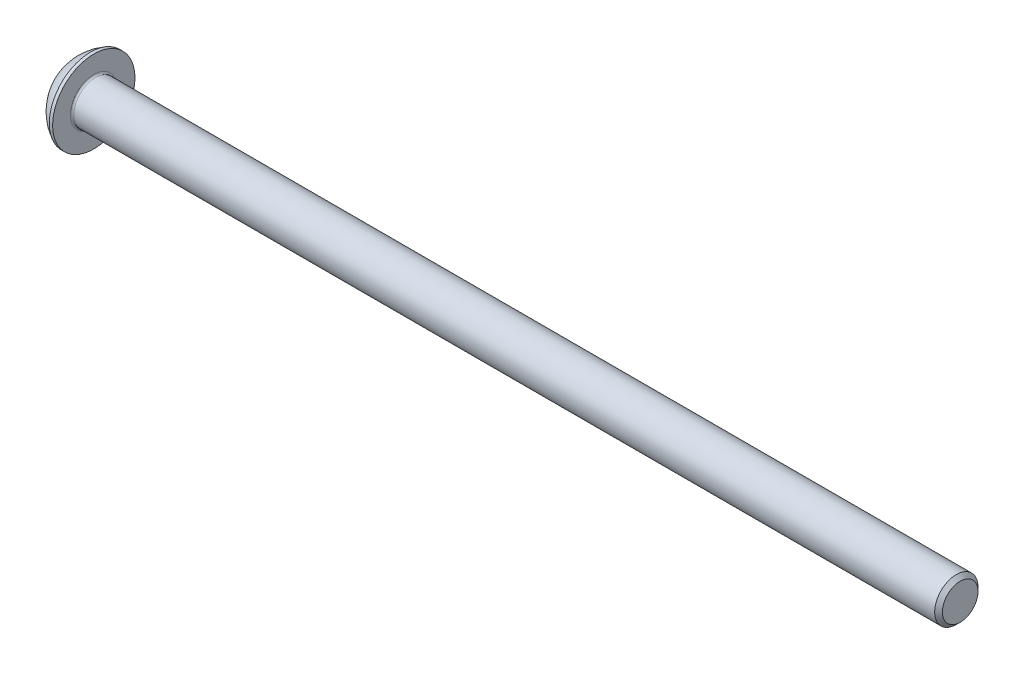
ISO-10303-21;
HEADER;
FILE_DESCRIPTION(('STEP AP214'),'2;1');
FILE_NAME('part.step','',(''),(''),'','','');
FILE_SCHEMA(('AUTOMOTIVE_DESIGN { 1 0 10303 214 1 1 1 1 }'));
ENDSEC;
DATA;
#1=APPLICATION_CONTEXT('core data for automotive mechanical design processes');
#2=APPLICATION_PROTOCOL_DEFINITION('international standard','automotive_design',2000,#1);
#3=PRODUCT_CONTEXT('',#1,'mechanical');
#4=PRODUCT('Part','Part','',(#3));
#5=PRODUCT_RELATED_PRODUCT_CATEGORY('part','',(#4));
#6=PRODUCT_DEFINITION_FORMATION('','',#4);
#7=PRODUCT_DEFINITION_CONTEXT('part definition',#1,'design');
#8=PRODUCT_DEFINITION('design','',#6,#7);
#9=PRODUCT_DEFINITION_SHAPE('','',#8);
#10=(LENGTH_UNIT() NAMED_UNIT(*) SI_UNIT(.MILLI.,.METRE.));
#11=(NAMED_UNIT(*) PLANE_ANGLE_UNIT() SI_UNIT($,.RADIAN.));
#12=(NAMED_UNIT(*) SI_UNIT($,.STERADIAN.) SOLID_ANGLE_UNIT());
#13=UNCERTAINTY_MEASURE_WITH_UNIT(LENGTH_MEASURE(1.E-05),#10,'distance_accuracy_value','');
#14=(GEOMETRIC_REPRESENTATION_CONTEXT(3) GLOBAL_UNCERTAINTY_ASSIGNED_CONTEXT((#13)) GLOBAL_UNIT_ASSIGNED_CONTEXT((#10,
#11,#12)) REPRESENTATION_CONTEXT('',''));
#15=CARTESIAN_POINT('',(0.,0.,0.));
#16=DIRECTION('',(0.,0.,1.));
#17=DIRECTION('',(1.,0.,0.));
#18=AXIS2_PLACEMENT_3D('',#15,#16,#17);
#19=CARTESIAN_POINT('',(0.,0.,0.));
#20=DIRECTION('',(-1.,0.,0.));
#21=DIRECTION('',(0.,0.,1.));
#22=AXIS2_PLACEMENT_3D('',#19,#20,#21);
#23=PLANE('',#22);
#24=CARTESIAN_POINT('',(0.,0.,0.));
#25=DIRECTION('',(-1.,0.,0.));
#26=DIRECTION('',(0.,0.,1.));
#27=AXIS2_PLACEMENT_3D('',#24,#25,#26);
#28=CIRCLE('',#27,2.375);
#29=CARTESIAN_POINT('',(0.,2.375,0.));
#30=VERTEX_POINT('',#29);
#31=EDGE_CURVE('E155',#30,#30,#28,.T.);
#32=ORIENTED_EDGE('',*,*,#31,.T.);
#33=EDGE_LOOP('',(#32));
#34=FACE_BOUND('',#33,.T.);
#35=DIRECTION('',(0.,-1.,0.));
#36=VECTOR('',#35,1.);
#37=CARTESIAN_POINT('',(0.,-0.866025403784438,1.5));
#38=LINE('',#37,#36);
#39=CARTESIAN_POINT('',(0.,0.866025403784439,1.5));
#40=VERTEX_POINT('',#39);
#41=CARTESIAN_POINT('',(0.,-0.866025403784438,1.5));
#42=VERTEX_POINT('',#41);
#43=EDGE_CURVE('E50',#40,#42,#38,.T.);
#44=ORIENTED_EDGE('',*,*,#43,.T.);
#45=DIRECTION('',(0.,-0.500000000000001,-0.866025403784438));
#46=VECTOR('',#45,1.);
#47=CARTESIAN_POINT('',(0.,-1.73205080756888,0.));
#48=LINE('',#47,#46);
#49=CARTESIAN_POINT('',(0.,-1.73205080756888,0.));
#50=VERTEX_POINT('',#49);
#51=EDGE_CURVE('E275',#42,#50,#48,.T.);
#52=ORIENTED_EDGE('',*,*,#51,.T.);
#53=DIRECTION('',(0.,0.500000000000001,-0.866025403784438));
#54=VECTOR('',#53,1.);
#55=CARTESIAN_POINT('',(0.,-0.866025403784438,-1.5));
#56=LINE('',#55,#54);
#57=CARTESIAN_POINT('',(0.,-0.866025403784438,-1.5));
#58=VERTEX_POINT('',#57);
#59=EDGE_CURVE('E130',#50,#58,#56,.T.);
#60=ORIENTED_EDGE('',*,*,#59,.T.);
#61=DIRECTION('',(0.,1.,0.));
#62=VECTOR('',#61,1.);
#63=CARTESIAN_POINT('',(0.,0.866025403784439,-1.5));
#64=LINE('',#63,#62);
#65=CARTESIAN_POINT('',(0.,0.866025403784439,-1.5));
#66=VERTEX_POINT('',#65);
#67=EDGE_CURVE('E278',#58,#66,#64,.T.);
#68=ORIENTED_EDGE('',*,*,#67,.T.);
#69=DIRECTION('',(0.,0.5,0.866025403784439));
#70=VECTOR('',#69,1.);
#71=CARTESIAN_POINT('',(0.,1.73205080756888,0.));
#72=LINE('',#71,#70);
#73=CARTESIAN_POINT('',(0.,1.73205080756888,0.));
#74=VERTEX_POINT('',#73);
#75=EDGE_CURVE('E280',#66,#74,#72,.T.);
#76=ORIENTED_EDGE('',*,*,#75,.T.);
#77=DIRECTION('',(0.,-0.5,0.866025403784439));
#78=VECTOR('',#77,1.);
#79=CARTESIAN_POINT('',(0.,0.866025403784439,1.5));
#80=LINE('',#79,#78);
#81=EDGE_CURVE('E282',#74,#40,#80,.T.);
#82=ORIENTED_EDGE('',*,*,#81,.T.);
#83=EDGE_LOOP('',(#44,#52,#60,#68,#76,#82));
#84=FACE_BOUND('',#83,.T.);
#85=ADVANCED_FACE('F35',(#34,#84),#23,.T.);
#86=CARTESIAN_POINT('',(4.75501582278481,0.,0.));
#87=DIRECTION('',(-1.,0.,0.));
#88=DIRECTION('',(0.,1.,0.));
#89=AXIS2_PLACEMENT_3D('',#86,#87,#88);
#90=SPHERICAL_SURFACE('',#89,5.3151482081814);
#91=CARTESIAN_POINT('',(2.37,0.,0.));
#92=DIRECTION('',(-1.,0.,0.));
#93=DIRECTION('',(0.,0.,1.));
#94=AXIS2_PLACEMENT_3D('',#91,#92,#93);
#95=CIRCLE('',#94,4.75);
#96=CARTESIAN_POINT('',(2.37,4.75,0.));
#97=VERTEX_POINT('',#96);
#98=EDGE_CURVE('E152',#97,#97,#95,.T.);
#99=CARTESIAN_POINT('',(2.37,4.75,0.));
#100=CARTESIAN_POINT('',(2.33822259048669,4.73404434732511,0.));
#101=CARTESIAN_POINT('',(2.30660534291523,4.71776971995817,0.));
#102=CARTESIAN_POINT('',(2.24370380094997,4.68458927158339,0.));
#103=CARTESIAN_POINT('',(2.21241950655618,4.66768345057555,0.));
#104=CARTESIAN_POINT('',(2.15019650024021,4.6332473706621,0.));
#105=CARTESIAN_POINT('',(2.11925778831804,4.6157171117565,0.));
#106=CARTESIAN_POINT('',(2.05773840110808,4.58003923142985,0.));
#107=CARTESIAN_POINT('',(2.02715772582028,4.56189161000879,0.));
#108=CARTESIAN_POINT('',(1.96636673145741,4.52498631044657,0.));
#109=CARTESIAN_POINT('',(1.93615641238234,4.50622863230542,0.));
#110=CARTESIAN_POINT('',(1.87611829826807,4.46811077571318,0.));
#111=CARTESIAN_POINT('',(1.84629050322887,4.4487505972621,0.));
#112=CARTESIAN_POINT('',(1.78702945162455,4.40943553782984,0.));
#113=CARTESIAN_POINT('',(1.75759619505941,4.38948065684866,0.));
#114=CARTESIAN_POINT('',(1.69913607574061,4.34898423002648,0.));
#115=CARTESIAN_POINT('',(1.67010921298694,4.32844268418549,0.));
#116=CARTESIAN_POINT('',(1.61247357298735,4.28678120152175,0.));
#117=CARTESIAN_POINT('',(1.58386479574144,4.265661264699,0.));
#118=CARTESIAN_POINT('',(1.52707685004032,4.22285150694424,0.));
#119=CARTESIAN_POINT('',(1.49889768158512,4.20116168601223,0.));
#120=CARTESIAN_POINT('',(1.44298030371049,4.15722089644741,0.));
#121=CARTESIAN_POINT('',(1.41524209429107,4.13496992781461,0.));
#122=CARTESIAN_POINT('',(1.36021780711889,4.08991580528235,0.));
#123=CARTESIAN_POINT('',(1.33293172936613,4.06711265138288,0.));
#124=CARTESIAN_POINT('',(1.278822696045,4.02096334316478,0.));
#125=CARTESIAN_POINT('',(1.25199974047662,3.99761718884614,0.));
#126=CARTESIAN_POINT('',(1.19882775550162,3.95039128335163,0.));
#127=CARTESIAN_POINT('',(1.172478726095,3.92651153217576,0.));
#128=CARTESIAN_POINT('',(1.1202652065289,3.87822805145535,0.));
#129=CARTESIAN_POINT('',(1.09440071636942,3.85382432191081,0.));
#130=CARTESIAN_POINT('',(1.04316669321618,3.8045027139941,0.));
#131=CARTESIAN_POINT('',(1.01779716022241,3.77958483562192,0.));
#132=CARTESIAN_POINT('',(0.9675632699561,3.72924496668416,0.));
#133=CARTESIAN_POINT('',(0.942698912683562,3.70382297611859,0.));
#134=CARTESIAN_POINT('',(0.893485388936279,3.65248512247887,0.));
#135=CARTESIAN_POINT('',(0.869136222461535,3.62656925940472,0.));
#136=CARTESIAN_POINT('',(0.820962887873489,3.57425409935885,0.));
#137=CARTESIAN_POINT('',(0.797138719760188,3.54785480238711,0.));
#138=CARTESIAN_POINT('',(0.750024977995378,3.49458340787865,0.));
#139=CARTESIAN_POINT('',(0.726735404343869,3.46771131034191,0.));
#140=CARTESIAN_POINT('',(0.68070023227454,3.41350513847464,0.));
#141=CARTESIAN_POINT('',(0.657954633856721,3.3861710641441,0.));
#142=CARTESIAN_POINT('',(0.613016573919582,3.33105194853939,0.));
#143=CARTESIAN_POINT('',(0.590824112400263,3.30326690726522,0.));
#144=CARTESIAN_POINT('',(0.547001265128254,3.24725704926748,0.));
#145=CARTESIAN_POINT('',(0.525370879375564,3.21903223254391,0.));
#146=CARTESIAN_POINT('',(0.482680896105488,3.16215419227902,0.));
#147=CARTESIAN_POINT('',(0.461621298588104,3.13350096873769,0.));
#148=CARTESIAN_POINT('',(0.420081374357153,3.07577765602273,0.));
#149=CARTESIAN_POINT('',(0.399601047643587,3.04670756684908,0.));
#150=CARTESIAN_POINT('',(0.359227914239947,2.98816223197683,0.));
#151=CARTESIAN_POINT('',(0.339335107549873,2.95868698627822,0.));
#152=CARTESIAN_POINT('',(0.300145026860787,2.89934321060632,0.));
#153=CARTESIAN_POINT('',(0.280847752861776,2.86947468063304,0.));
#154=CARTESIAN_POINT('',(0.24285650999714,2.80935636725696,0.));
#155=CARTESIAN_POINT('',(0.224162541131515,2.77910658385417,0.));
#156=CARTESIAN_POINT('',(0.187385439283607,2.71823794734018,0.));
#157=CARTESIAN_POINT('',(0.169302306301324,2.68761909422898,0.));
#158=CARTESIAN_POINT('',(0.133754156035988,2.626024653246,0.));
#159=CARTESIAN_POINT('',(0.116289138752934,2.59504906537422,0.));
#160=CARTESIAN_POINT('',(0.081984269005742,2.53275362391635,0.));
#161=CARTESIAN_POINT('',(0.0651444165416036,2.50143377033028,0.));
#162=CARTESIAN_POINT('',(0.0320966055444289,2.43846244094735,0.));
#163=CARTESIAN_POINT('',(0.0158886470113927,2.40681096515049,0.));
#164=CARTESIAN_POINT('',(0.,2.375,0.));
#165=B_SPLINE_CURVE_WITH_KNOTS('',3,(#99,#100,#101,#102,#103,#104,#105,#106,#107,#108,#109,#110,
#111,#112,#113,#114,#115,#116,#117,#118,#119,#120,#121,#122,#123,#124,#125,#126,#127,#128,#129,
#130,#131,#132,#133,#134,#135,#136,#137,#138,#139,#140,#141,#142,#143,#144,#145,#146,#147,#148,
#149,#150,#151,#152,#153,#154,#155,#156,#157,#158,#159,#160,#161,#162,#163,#164),.UNSPECIFIED.,
.F.,.F.,(4,2,2,2,2,2,2,2,2,2,2,2,2,2,2,2,2,2,2,2,2,2,2,2,2,2,2,2,2,2,2,2,4),(0.,
0.106672849678272,0.213345699356545,0.320018549034817,0.42669139871309,0.533364248391363,
0.640037098069635,0.746709947747908,0.85338279742618,0.960055647104452,1.06672849678273,
1.173401346461,1.28007419613927,1.38674704581754,1.49341989549582,1.60009274517409,
1.70676559485236,1.81343844453063,1.9201112942089,2.02678414388718,2.13345699356545,
2.24012984324372,2.346802692922,2.45347554260027,2.56014839227854,2.66682124195681,
2.77349409163509,2.88016694131336,2.98683979099163,3.0935126406699,3.20018549034817,
3.30685834002645,3.41353118970472),.UNSPECIFIED.);
#166=EDGE_CURVE('BSEAM176',#97,#30,#165,.T.);
#167=ORIENTED_EDGE('',*,*,#98,.T.);
#168=ORIENTED_EDGE('',*,*,#31,.F.);
#169=ORIENTED_EDGE('',*,*,#166,.T.);
#170=ORIENTED_EDGE('',*,*,#166,.F.);
#171=EDGE_LOOP('',(#167,#169,#168,#170));
#172=FACE_BOUND('',#171,.T.);
#173=ADVANCED_FACE('F176',(#172),#90,.T.);
#174=CARTESIAN_POINT('',(0.,0.,0.));
#175=DIRECTION('',(-1.,0.,0.));
#176=DIRECTION('',(0.,0.,1.));
#177=AXIS2_PLACEMENT_3D('',#174,#175,#176);
#178=CYLINDRICAL_SURFACE('',#177,4.75);
#179=ORIENTED_EDGE('',*,*,#98,.F.);
#180=EDGE_LOOP('',(#179));
#181=FACE_BOUND('',#180,.T.);
#182=CARTESIAN_POINT('',(2.75,0.,0.));
#183=DIRECTION('',(-1.,0.,0.));
#184=DIRECTION('',(0.,0.,1.));
#185=AXIS2_PLACEMENT_3D('',#182,#183,#184);
#186=CIRCLE('',#185,4.75);
#187=CARTESIAN_POINT('',(2.75,0.,4.75));
#188=VERTEX_POINT('',#187);
#189=EDGE_CURVE('E149',#188,#188,#186,.T.);
#190=ORIENTED_EDGE('',*,*,#189,.T.);
#191=EDGE_LOOP('',(#190));
#192=FACE_BOUND('',#191,.T.);
#193=ADVANCED_FACE('F181',(#181,#192),#178,.T.);
#194=CARTESIAN_POINT('',(2.75,2.5,0.));
#195=DIRECTION('',(-1.,0.,0.));
#196=DIRECTION('',(0.,0.,1.));
#197=AXIS2_PLACEMENT_3D('',#194,#195,#196);
#198=PLANE('',#197);
#199=CARTESIAN_POINT('',(2.75,0.,0.));
#200=DIRECTION('',(-1.,0.,0.));
#201=DIRECTION('',(0.,0.,1.));
#202=AXIS2_PLACEMENT_3D('',#199,#200,#201);
#203=CIRCLE('',#202,2.70000000000001);
#204=CARTESIAN_POINT('',(2.75,0.,2.70000000000001));
#205=VERTEX_POINT('',#204);
#206=EDGE_CURVE('E43',#205,#205,#203,.T.);
#207=ORIENTED_EDGE('',*,*,#206,.T.);
#208=EDGE_LOOP('',(#207));
#209=FACE_BOUND('',#208,.T.);
#210=ORIENTED_EDGE('',*,*,#189,.F.);
#211=EDGE_LOOP('',(#210));
#212=FACE_BOUND('',#211,.T.);
#213=ADVANCED_FACE('F160',(#209,#212),#198,.F.);
#214=CARTESIAN_POINT('',(0.,0.,0.));
#215=DIRECTION('',(-1.,0.,0.));
#216=DIRECTION('',(0.,0.,1.));
#217=AXIS2_PLACEMENT_3D('',#214,#215,#216);
#218=CYLINDRICAL_SURFACE('',#217,2.50000000000001);
#219=CARTESIAN_POINT('',(2.95,0.,0.));
#220=DIRECTION('',(-1.,0.,0.));
#221=DIRECTION('',(0.,0.,1.));
#222=AXIS2_PLACEMENT_3D('',#219,#220,#221);
#223=CIRCLE('',#222,2.50000000000001);
#224=CARTESIAN_POINT('',(2.95,0.,2.50000000000001));
#225=VERTEX_POINT('',#224);
#226=EDGE_CURVE('E11',#225,#225,#223,.F.);
#227=ORIENTED_EDGE('',*,*,#226,.T.);
#228=EDGE_LOOP('',(#227));
#229=FACE_BOUND('',#228,.T.);
#230=CARTESIAN_POINT('',(102.305,0.,0.));
#231=DIRECTION('',(-1.,0.,0.));
#232=DIRECTION('',(0.,0.,1.));
#233=AXIS2_PLACEMENT_3D('',#230,#231,#232);
#234=CIRCLE('',#233,2.50000000000002);
#235=CARTESIAN_POINT('',(102.305,0.,2.50000000000002));
#236=VERTEX_POINT('',#235);
#237=EDGE_CURVE('E146',#236,#236,#234,.T.);
#238=ORIENTED_EDGE('',*,*,#237,.T.);
#239=EDGE_LOOP('',(#238));
#240=FACE_BOUND('',#239,.T.);
#241=ADVANCED_FACE('F190',(#229,#240),#218,.T.);
#242=CARTESIAN_POINT('',(102.75,0.,0.));
#243=DIRECTION('',(-1.,0.,0.));
#244=DIRECTION('',(0.,0.,1.));
#245=AXIS2_PLACEMENT_3D('',#242,#243,#244);
#246=CONICAL_SURFACE('',#245,2.055,0.785398163397342);
#247=ORIENTED_EDGE('',*,*,#237,.F.);
#248=EDGE_LOOP('',(#247));
#249=FACE_BOUND('',#248,.T.);
#250=CARTESIAN_POINT('',(102.75,0.,0.));
#251=DIRECTION('',(-1.,0.,0.));
#252=DIRECTION('',(0.,0.,1.));
#253=AXIS2_PLACEMENT_3D('',#250,#251,#252);
#254=CIRCLE('',#253,2.055);
#255=CARTESIAN_POINT('',(102.75,0.,2.055));
#256=VERTEX_POINT('',#255);
#257=EDGE_CURVE('E142',#256,#256,#254,.T.);
#258=ORIENTED_EDGE('',*,*,#257,.T.);
#259=EDGE_LOOP('',(#258));
#260=FACE_BOUND('',#259,.T.);
#261=ADVANCED_FACE('F171',(#249,#260),#246,.T.);
#262=CARTESIAN_POINT('',(102.75,0.,0.));
#263=DIRECTION('',(-1.,0.,0.));
#264=DIRECTION('',(0.,0.,1.));
#265=AXIS2_PLACEMENT_3D('',#262,#263,#264);
#266=PLANE('',#265);
#267=ORIENTED_EDGE('',*,*,#257,.F.);
#268=EDGE_LOOP('',(#267));
#269=FACE_BOUND('',#268,.T.);
#270=ADVANCED_FACE('F164',(#269),#266,.F.);
#271=CARTESIAN_POINT('',(2.95,0.,0.));
#272=DIRECTION('',(-1.,0.,0.));
#273=DIRECTION('',(0.,0.,1.));
#274=AXIS2_PLACEMENT_3D('',#271,#272,#273);
#275=TOROIDAL_SURFACE('',#274,2.70000000000001,0.2);
#276=ORIENTED_EDGE('',*,*,#226,.F.);
#277=EDGE_LOOP('',(#276));
#278=FACE_BOUND('',#277,.T.);
#279=ORIENTED_EDGE('',*,*,#206,.F.);
#280=EDGE_LOOP('',(#279));
#281=FACE_BOUND('',#280,.T.);
#282=ADVANCED_FACE('F37',(#278,#281),#275,.F.);
#283=CARTESIAN_POINT('',(1.56,-1.73205080756888,0.));
#284=DIRECTION('',(0.,0.866025403784438,-0.500000000000001));
#285=DIRECTION('',(0.,0.500000000000001,0.866025403784438));
#286=AXIS2_PLACEMENT_3D('',#283,#284,#285);
#287=PLANE('',#286);
#288=DIRECTION('',(0.,-0.500000000000001,-0.866025403784438));
#289=VECTOR('',#288,1.);
#290=CARTESIAN_POINT('',(1.56,-1.73205080756888,0.));
#291=LINE('',#290,#289);
#292=CARTESIAN_POINT('',(1.56,-0.866025403784438,1.5));
#293=VERTEX_POINT('',#292);
#294=CARTESIAN_POINT('',(1.56,-1.29903810567666,0.750000000000002));
#295=VERTEX_POINT('',#294);
#296=EDGE_CURVE('E116',#293,#295,#291,.T.);
#297=ORIENTED_EDGE('',*,*,#296,.T.);
#298=CARTESIAN_POINT('',(1.56,-1.73205080756888,0.));
#299=VERTEX_POINT('',#298);
#300=EDGE_CURVE('E111',#295,#299,#291,.T.);
#301=ORIENTED_EDGE('',*,*,#300,.T.);
#302=DIRECTION('',(-1.,0.,0.));
#303=VECTOR('',#302,1.);
#304=CARTESIAN_POINT('',(1.56,-1.73205080756888,0.));
#305=LINE('',#304,#303);
#306=EDGE_CURVE('E113',#299,#50,#305,.T.);
#307=ORIENTED_EDGE('',*,*,#306,.T.);
#308=ORIENTED_EDGE('',*,*,#51,.F.);
#309=DIRECTION('',(-1.,0.,0.));
#310=VECTOR('',#309,1.);
#311=CARTESIAN_POINT('',(1.56,-0.866025403784438,1.5));
#312=LINE('',#311,#310);
#313=EDGE_CURVE('E271',#293,#42,#312,.T.);
#314=ORIENTED_EDGE('',*,*,#313,.F.);
#315=EDGE_LOOP('',(#297,#301,#307,#308,#314));
#316=FACE_BOUND('',#315,.T.);
#317=ADVANCED_FACE('F112',(#316),#287,.T.);
#318=CARTESIAN_POINT('',(1.56,-0.866025403784438,-1.5));
#319=DIRECTION('',(0.,0.866025403784438,0.500000000000001));
#320=DIRECTION('',(0.,-0.500000000000001,0.866025403784438));
#321=AXIS2_PLACEMENT_3D('',#318,#319,#320);
#322=PLANE('',#321);
#323=DIRECTION('',(0.,0.500000000000001,-0.866025403784438));
#324=VECTOR('',#323,1.);
#325=CARTESIAN_POINT('',(1.56,-0.866025403784438,-1.5));
#326=LINE('',#325,#324);
#327=CARTESIAN_POINT('',(1.56,-1.29903810567666,-0.750000000000001));
#328=VERTEX_POINT('',#327);
#329=EDGE_CURVE('E58',#299,#328,#326,.T.);
#330=ORIENTED_EDGE('',*,*,#329,.T.);
#331=CARTESIAN_POINT('',(1.56,-0.866025403784438,-1.5));
#332=VERTEX_POINT('',#331);
#333=EDGE_CURVE('E125',#328,#332,#326,.T.);
#334=ORIENTED_EDGE('',*,*,#333,.T.);
#335=DIRECTION('',(-1.,0.,0.));
#336=VECTOR('',#335,1.);
#337=CARTESIAN_POINT('',(1.56,-0.866025403784438,-1.5));
#338=LINE('',#337,#336);
#339=EDGE_CURVE('E132',#332,#58,#338,.T.);
#340=ORIENTED_EDGE('',*,*,#339,.T.);
#341=ORIENTED_EDGE('',*,*,#59,.F.);
#342=ORIENTED_EDGE('',*,*,#306,.F.);
#343=EDGE_LOOP('',(#330,#334,#340,#341,#342));
#344=FACE_BOUND('',#343,.T.);
#345=ADVANCED_FACE('F128',(#344),#322,.T.);
#346=CARTESIAN_POINT('',(1.56,0.866025403784439,-1.5));
#347=DIRECTION('',(0.,0.,1.));
#348=DIRECTION('',(1.,0.,0.));
#349=AXIS2_PLACEMENT_3D('',#346,#347,#348);
#350=PLANE('',#349);
#351=DIRECTION('',(0.,1.,0.));
#352=VECTOR('',#351,1.);
#353=CARTESIAN_POINT('',(1.56,0.866025403784439,-1.5));
#354=LINE('',#353,#352);
#355=CARTESIAN_POINT('',(1.56,0.,-1.5));
#356=VERTEX_POINT('',#355);
#357=EDGE_CURVE('E252',#332,#356,#354,.T.);
#358=ORIENTED_EDGE('',*,*,#357,.T.);
#359=CARTESIAN_POINT('',(1.56,0.866025403784439,-1.5));
#360=VERTEX_POINT('',#359);
#361=EDGE_CURVE('E124',#356,#360,#354,.T.);
#362=ORIENTED_EDGE('',*,*,#361,.T.);
#363=DIRECTION('',(-1.,0.,0.));
#364=VECTOR('',#363,1.);
#365=CARTESIAN_POINT('',(1.56,0.866025403784439,-1.5));
#366=LINE('',#365,#364);
#367=EDGE_CURVE('E137',#360,#66,#366,.T.);
#368=ORIENTED_EDGE('',*,*,#367,.T.);
#369=ORIENTED_EDGE('',*,*,#67,.F.);
#370=ORIENTED_EDGE('',*,*,#339,.F.);
#371=EDGE_LOOP('',(#358,#362,#368,#369,#370));
#372=FACE_BOUND('',#371,.T.);
#373=ADVANCED_FACE('F204',(#372),#350,.T.);
#374=CARTESIAN_POINT('',(1.56,1.73205080756888,0.));
#375=DIRECTION('',(0.,-0.866025403784439,0.5));
#376=DIRECTION('',(0.,-0.5,-0.866025403784439));
#377=AXIS2_PLACEMENT_3D('',#374,#375,#376);
#378=PLANE('',#377);
#379=DIRECTION('',(0.,0.5,0.866025403784439));
#380=VECTOR('',#379,1.);
#381=CARTESIAN_POINT('',(1.56,1.73205080756888,0.));
#382=LINE('',#381,#380);
#383=CARTESIAN_POINT('',(1.56,1.29903810567666,-0.75));
#384=VERTEX_POINT('',#383);
#385=EDGE_CURVE('E241',#360,#384,#382,.T.);
#386=ORIENTED_EDGE('',*,*,#385,.T.);
#387=CARTESIAN_POINT('',(1.56,1.73205080756888,0.));
#388=VERTEX_POINT('',#387);
#389=EDGE_CURVE('E246',#384,#388,#382,.T.);
#390=ORIENTED_EDGE('',*,*,#389,.T.);
#391=DIRECTION('',(-1.,0.,0.));
#392=VECTOR('',#391,1.);
#393=CARTESIAN_POINT('',(1.56,1.73205080756888,0.));
#394=LINE('',#393,#392);
#395=EDGE_CURVE('E286',#388,#74,#394,.T.);
#396=ORIENTED_EDGE('',*,*,#395,.T.);
#397=ORIENTED_EDGE('',*,*,#75,.F.);
#398=ORIENTED_EDGE('',*,*,#367,.F.);
#399=EDGE_LOOP('',(#386,#390,#396,#397,#398));
#400=FACE_BOUND('',#399,.T.);
#401=ADVANCED_FACE('F207',(#400),#378,.T.);
#402=CARTESIAN_POINT('',(1.56,0.866025403784439,1.5));
#403=DIRECTION('',(0.,-0.866025403784439,-0.5));
#404=DIRECTION('',(0.,0.5,-0.866025403784439));
#405=AXIS2_PLACEMENT_3D('',#402,#403,#404);
#406=PLANE('',#405);
#407=DIRECTION('',(0.,-0.5,0.866025403784439));
#408=VECTOR('',#407,1.);
#409=CARTESIAN_POINT('',(1.56,0.866025403784439,1.5));
#410=LINE('',#409,#408);
#411=CARTESIAN_POINT('',(1.56,1.29903810567666,0.75));
#412=VERTEX_POINT('',#411);
#413=EDGE_CURVE('E249',#388,#412,#410,.T.);
#414=ORIENTED_EDGE('',*,*,#413,.T.);
#415=CARTESIAN_POINT('',(1.56,0.866025403784439,1.5));
#416=VERTEX_POINT('',#415);
#417=EDGE_CURVE('E257',#412,#416,#410,.T.);
#418=ORIENTED_EDGE('',*,*,#417,.T.);
#419=DIRECTION('',(-1.,0.,0.));
#420=VECTOR('',#419,1.);
#421=CARTESIAN_POINT('',(1.56,0.866025403784439,1.5));
#422=LINE('',#421,#420);
#423=EDGE_CURVE('E270',#416,#40,#422,.T.);
#424=ORIENTED_EDGE('',*,*,#423,.T.);
#425=ORIENTED_EDGE('',*,*,#81,.F.);
#426=ORIENTED_EDGE('',*,*,#395,.F.);
#427=EDGE_LOOP('',(#414,#418,#424,#425,#426));
#428=FACE_BOUND('',#427,.T.);
#429=ADVANCED_FACE('F211',(#428),#406,.T.);
#430=CARTESIAN_POINT('',(1.56,-0.866025403784438,1.5));
#431=DIRECTION('',(0.,0.,-1.));
#432=DIRECTION('',(-1.,0.,0.));
#433=AXIS2_PLACEMENT_3D('',#430,#431,#432);
#434=PLANE('',#433);
#435=DIRECTION('',(0.,-1.,0.));
#436=VECTOR('',#435,1.);
#437=CARTESIAN_POINT('',(1.56,-0.866025403784438,1.5));
#438=LINE('',#437,#436);
#439=CARTESIAN_POINT('',(1.56,0.,1.5));
#440=VERTEX_POINT('',#439);
#441=EDGE_CURVE('E263',#416,#440,#438,.T.);
#442=ORIENTED_EDGE('',*,*,#441,.T.);
#443=EDGE_CURVE('E265',#440,#293,#438,.T.);
#444=ORIENTED_EDGE('',*,*,#443,.T.);
#445=ORIENTED_EDGE('',*,*,#313,.T.);
#446=ORIENTED_EDGE('',*,*,#43,.F.);
#447=ORIENTED_EDGE('',*,*,#423,.F.);
#448=EDGE_LOOP('',(#442,#444,#445,#446,#447));
#449=FACE_BOUND('',#448,.T.);
#450=ADVANCED_FACE('F215',(#449),#434,.T.);
#451=CARTESIAN_POINT('',(1.56,-1.73205080756888,0.));
#452=DIRECTION('',(1.,0.,0.));
#453=DIRECTION('',(0.,0.,-1.));
#454=AXIS2_PLACEMENT_3D('',#451,#452,#453);
#455=PLANE('',#454);
#456=CARTESIAN_POINT('',(1.56,0.,0.));
#457=DIRECTION('',(-1.,0.,0.));
#458=DIRECTION('',(0.,0.,1.));
#459=AXIS2_PLACEMENT_3D('',#456,#457,#458);
#460=CIRCLE('',#459,1.5);
#461=EDGE_CURVE('E238',#384,#356,#460,.T.);
#462=ORIENTED_EDGE('',*,*,#461,.F.);
#463=ORIENTED_EDGE('',*,*,#385,.F.);
#464=ORIENTED_EDGE('',*,*,#361,.F.);
#465=EDGE_LOOP('',(#462,#463,#464));
#466=FACE_BOUND('',#465,.T.);
#467=ADVANCED_FACE('F219',(#466),#455,.F.);
#468=EDGE_CURVE('E143',#412,#384,#460,.T.);
#469=ORIENTED_EDGE('',*,*,#468,.F.);
#470=ORIENTED_EDGE('',*,*,#413,.F.);
#471=ORIENTED_EDGE('',*,*,#389,.F.);
#472=EDGE_LOOP('',(#469,#470,#471));
#473=FACE_BOUND('',#472,.T.);
#474=ADVANCED_FACE('F228',(#473),#455,.F.);
#475=EDGE_CURVE('E136',#440,#412,#460,.T.);
#476=ORIENTED_EDGE('',*,*,#475,.F.);
#477=ORIENTED_EDGE('',*,*,#441,.F.);
#478=ORIENTED_EDGE('',*,*,#417,.F.);
#479=EDGE_LOOP('',(#476,#477,#478));
#480=FACE_BOUND('',#479,.T.);
#481=ADVANCED_FACE('F233',(#480),#455,.F.);
#482=EDGE_CURVE('E131',#295,#440,#460,.T.);
#483=ORIENTED_EDGE('',*,*,#482,.F.);
#484=ORIENTED_EDGE('',*,*,#296,.F.);
#485=ORIENTED_EDGE('',*,*,#443,.F.);
#486=EDGE_LOOP('',(#483,#484,#485));
#487=FACE_BOUND('',#486,.T.);
#488=ADVANCED_FACE('F226',(#487),#455,.F.);
#489=EDGE_CURVE('E122',#328,#295,#460,.T.);
#490=ORIENTED_EDGE('',*,*,#489,.F.);
#491=ORIENTED_EDGE('',*,*,#329,.F.);
#492=ORIENTED_EDGE('',*,*,#300,.F.);
#493=EDGE_LOOP('',(#490,#491,#492));
#494=FACE_BOUND('',#493,.T.);
#495=ADVANCED_FACE('F121',(#494),#455,.F.);
#496=EDGE_CURVE('E244',#356,#328,#460,.T.);
#497=ORIENTED_EDGE('',*,*,#496,.F.);
#498=ORIENTED_EDGE('',*,*,#357,.F.);
#499=ORIENTED_EDGE('',*,*,#333,.F.);
#500=EDGE_LOOP('',(#497,#498,#499));
#501=FACE_BOUND('',#500,.T.);
#502=ADVANCED_FACE('F199',(#501),#455,.F.);
#503=CARTESIAN_POINT('',(2.42602540378445,0.,0.));
#504=DIRECTION('',(-1.,0.,0.));
#505=DIRECTION('',(0.,0.,1.));
#506=AXIS2_PLACEMENT_3D('',#503,#504,#505);
#507=CONICAL_SURFACE('',#506,0.,1.04719755119659);
#508=ORIENTED_EDGE('',*,*,#475,.T.);
#509=ORIENTED_EDGE('',*,*,#468,.T.);
#510=ORIENTED_EDGE('',*,*,#461,.T.);
#511=ORIENTED_EDGE('',*,*,#496,.T.);
#512=ORIENTED_EDGE('',*,*,#489,.T.);
#513=ORIENTED_EDGE('',*,*,#482,.T.);
#514=EDGE_LOOP('',(#508,#509,#510,#511,#512,#513));
#515=FACE_BOUND('',#514,.T.);
#516=CARTESIAN_POINT('',(2.42602540378445,0.,0.));
#517=VERTEX_POINT('',#516);
#518=VERTEX_LOOP('',#517);
#519=FACE_BOUND('',#518,.T.);
#520=ADVANCED_FACE('F197',(#515,#519),#507,.F.);
#521=CLOSED_SHELL('',(#85,#173,#193,#213,#241,#261,#270,#282,#317,#345,#373,#401,#429,#450,#467,
#474,#481,#488,#495,#502,#520));
#522=MANIFOLD_SOLID_BREP('B2',#521);
#523=ADVANCED_BREP_SHAPE_REPRESENTATION('',(#18,#522),#14);
#524=SHAPE_DEFINITION_REPRESENTATION(#9,#523);
ENDSEC;
END-ISO-10303-21;
